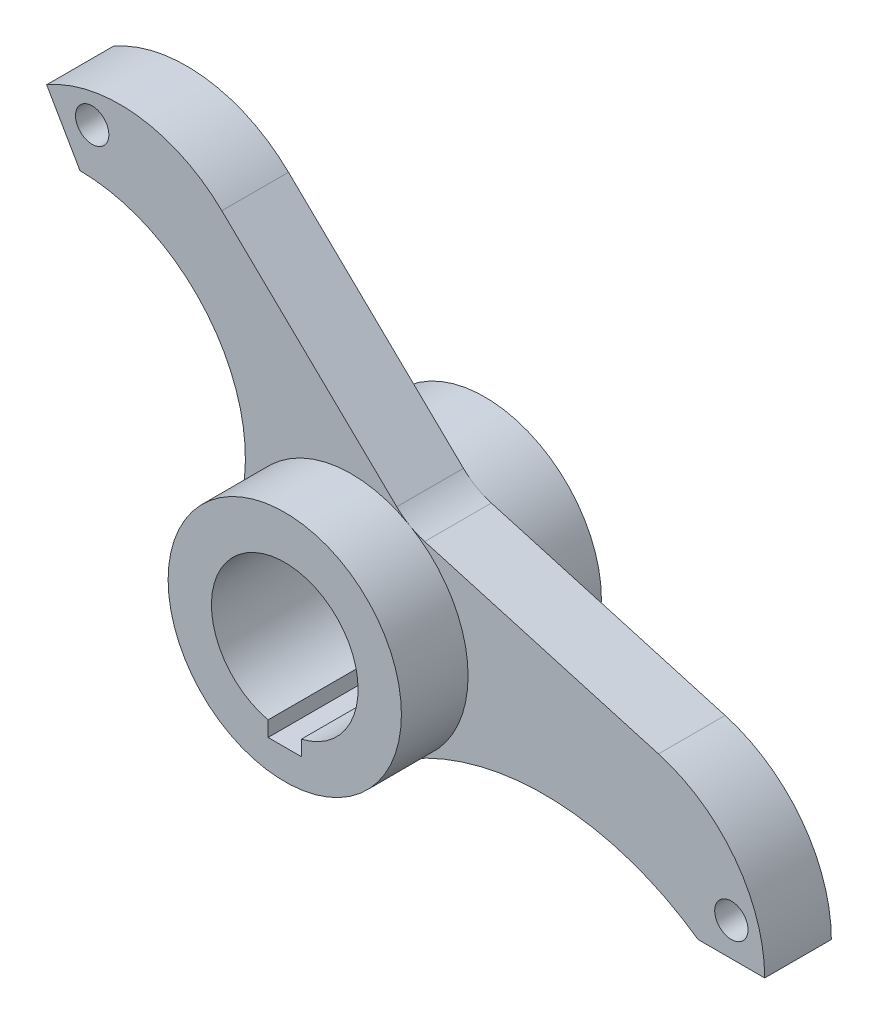
ISO-10303-21;
HEADER;
FILE_DESCRIPTION(('STEP AP214'),'2;1');
FILE_NAME('part.step','',(''),(''),'','','');
FILE_SCHEMA(('AUTOMOTIVE_DESIGN { 1 0 10303 214 1 1 1 1 }'));
ENDSEC;
DATA;
#1=APPLICATION_CONTEXT('core data for automotive mechanical design processes');
#2=APPLICATION_PROTOCOL_DEFINITION('international standard','automotive_design',2000,#1);
#3=PRODUCT_CONTEXT('',#1,'mechanical');
#4=PRODUCT('Part','Part','',(#3));
#5=PRODUCT_RELATED_PRODUCT_CATEGORY('part','',(#4));
#6=PRODUCT_DEFINITION_FORMATION('','',#4);
#7=PRODUCT_DEFINITION_CONTEXT('part definition',#1,'design');
#8=PRODUCT_DEFINITION('design','',#6,#7);
#9=PRODUCT_DEFINITION_SHAPE('','',#8);
#10=(LENGTH_UNIT() NAMED_UNIT(*) SI_UNIT(.MILLI.,.METRE.));
#11=(NAMED_UNIT(*) PLANE_ANGLE_UNIT() SI_UNIT($,.RADIAN.));
#12=(NAMED_UNIT(*) SI_UNIT($,.STERADIAN.) SOLID_ANGLE_UNIT());
#13=UNCERTAINTY_MEASURE_WITH_UNIT(LENGTH_MEASURE(1.E-05),#10,'distance_accuracy_value','');
#14=(GEOMETRIC_REPRESENTATION_CONTEXT(3) GLOBAL_UNCERTAINTY_ASSIGNED_CONTEXT((#13)) GLOBAL_UNIT_ASSIGNED_CONTEXT((#10,
#11,#12)) REPRESENTATION_CONTEXT('',''));
#15=CARTESIAN_POINT('',(0.,0.,0.));
#16=DIRECTION('',(0.,0.,1.));
#17=DIRECTION('',(1.,0.,0.));
#18=AXIS2_PLACEMENT_3D('',#15,#16,#17);
#19=CARTESIAN_POINT('',(13.7499999999999,23.8156986040721,5.));
#20=DIRECTION('',(0.,0.,-1.));
#21=DIRECTION('',(-1.,0.,0.));
#22=AXIS2_PLACEMENT_3D('',#19,#20,#21);
#23=CYLINDRICAL_SURFACE('',#22,10.);
#24=CARTESIAN_POINT('',(13.7499999999999,23.8156986040721,-5.));
#25=DIRECTION('',(0.,0.,1.));
#26=DIRECTION('',(1.,0.,0.));
#27=AXIS2_PLACEMENT_3D('',#24,#25,#26);
#28=CIRCLE('',#27,10.);
#29=CARTESIAN_POINT('',(6.80323629447186,16.6224744299233,-5.));
#30=VERTEX_POINT('',#29);
#31=CARTESIAN_POINT('',(8.74999999999996,15.1554445662277,-5.));
#32=VERTEX_POINT('',#31);
#33=EDGE_CURVE('E269',#30,#32,#28,.T.);
#34=ORIENTED_EDGE('',*,*,#33,.F.);
#35=DIRECTION('',(0.,0.,-1.));
#36=VECTOR('',#35,1.);
#37=CARTESIAN_POINT('',(6.80323629447186,16.6224744299233,5.));
#38=LINE('',#37,#36);
#39=CARTESIAN_POINT('',(6.80323629447186,16.6224744299233,5.));
#40=VERTEX_POINT('',#39);
#41=EDGE_CURVE('E11',#40,#30,#38,.T.);
#42=ORIENTED_EDGE('',*,*,#41,.F.);
#43=CARTESIAN_POINT('',(13.7499999999999,23.8156986040721,5.));
#44=DIRECTION('',(0.,0.,1.));
#45=DIRECTION('',(1.,0.,0.));
#46=AXIS2_PLACEMENT_3D('',#43,#44,#45);
#47=CIRCLE('',#46,10.);
#48=CARTESIAN_POINT('',(8.74999999999996,15.1554445662277,5.));
#49=VERTEX_POINT('',#48);
#50=EDGE_CURVE('E270',#40,#49,#47,.T.);
#51=ORIENTED_EDGE('',*,*,#50,.T.);
#52=CARTESIAN_POINT('',(13.7499999999999,23.8156986040721,5.));
#53=DIRECTION('',(0.,0.,1.));
#54=DIRECTION('',(1.,0.,0.));
#55=AXIS2_PLACEMENT_3D('',#52,#53,#54);
#56=CIRCLE('',#55,10.);
#57=CARTESIAN_POINT('',(10.9938669828349,14.2030126739227,5.));
#58=VERTEX_POINT('',#57);
#59=EDGE_CURVE('E187',#49,#58,#56,.T.);
#60=ORIENTED_EDGE('',*,*,#59,.T.);
#61=DIRECTION('',(0.,0.,-1.));
#62=VECTOR('',#61,1.);
#63=CARTESIAN_POINT('',(10.9938669828349,14.2030126739227,5.));
#64=LINE('',#63,#62);
#65=CARTESIAN_POINT('',(10.9938669828349,14.2030126739227,-5.));
#66=VERTEX_POINT('',#65);
#67=EDGE_CURVE('E210',#58,#66,#64,.T.);
#68=ORIENTED_EDGE('',*,*,#67,.T.);
#69=CARTESIAN_POINT('',(13.7499999999999,23.8156986040721,-5.));
#70=DIRECTION('',(0.,0.,1.));
#71=DIRECTION('',(1.,0.,0.));
#72=AXIS2_PLACEMENT_3D('',#69,#70,#71);
#73=CIRCLE('',#72,10.);
#74=EDGE_CURVE('E176',#32,#66,#73,.T.);
#75=ORIENTED_EDGE('',*,*,#74,.F.);
#76=EDGE_LOOP('',(#34,#42,#51,#60,#68,#75));
#77=FACE_BOUND('',#76,.T.);
#78=ADVANCED_FACE('F43',(#77),#23,.F.);
#79=CARTESIAN_POINT('',(11.5892622621873,12.0004314237112,5.));
#80=DIRECTION('',(0.694676370552807,0.719322417414874,0.));
#81=DIRECTION('',(-0.719322417414874,0.694676370552807,0.));
#82=AXIS2_PLACEMENT_3D('',#79,#80,#81);
#83=PLANE('',#82);
#84=DIRECTION('',(0.719322417414874,-0.694676370552807,0.));
#85=VECTOR('',#84,1.);
#86=CARTESIAN_POINT('',(11.5892622621873,12.0004314237112,-5.));
#87=LINE('',#86,#85);
#88=CARTESIAN_POINT('',(-19.4395517121738,41.9661093345046,-5.));
#89=VERTEX_POINT('',#88);
#90=EDGE_CURVE('E296',#89,#30,#87,.T.);
#91=ORIENTED_EDGE('',*,*,#90,.F.);
#92=DIRECTION('',(0.,0.,-1.));
#93=VECTOR('',#92,1.);
#94=CARTESIAN_POINT('',(-19.4395517121738,41.9661093345046,5.));
#95=LINE('',#94,#93);
#96=CARTESIAN_POINT('',(-19.4395517121738,41.9661093345046,5.));
#97=VERTEX_POINT('',#96);
#98=EDGE_CURVE('E51',#97,#89,#95,.T.);
#99=ORIENTED_EDGE('',*,*,#98,.F.);
#100=DIRECTION('',(0.719322417414874,-0.694676370552807,0.));
#101=VECTOR('',#100,1.);
#102=CARTESIAN_POINT('',(11.5892622621873,12.0004314237112,5.));
#103=LINE('',#102,#101);
#104=EDGE_CURVE('E274',#97,#40,#103,.T.);
#105=ORIENTED_EDGE('',*,*,#104,.T.);
#106=ORIENTED_EDGE('',*,*,#41,.T.);
#107=EDGE_LOOP('',(#91,#99,#105,#106));
#108=FACE_BOUND('',#107,.T.);
#109=ADVANCED_FACE('F330',(#108),#83,.T.);
#110=CARTESIAN_POINT('',(-34.7224318643356,26.1410161513774,5.));
#111=DIRECTION('',(0.,0.,-1.));
#112=DIRECTION('',(-1.,0.,0.));
#113=AXIS2_PLACEMENT_3D('',#110,#111,#112);
#114=CYLINDRICAL_SURFACE('',#113,22.);
#115=CARTESIAN_POINT('',(-34.7224318643356,26.1410161513774,-5.));
#116=DIRECTION('',(0.,0.,1.));
#117=DIRECTION('',(1.,0.,0.));
#118=AXIS2_PLACEMENT_3D('',#115,#116,#117);
#119=CIRCLE('',#118,22.);
#120=CARTESIAN_POINT('',(-45.7224318643357,45.193575034635,-5.));
#121=VERTEX_POINT('',#120);
#122=EDGE_CURVE('E300',#121,#89,#119,.F.);
#123=ORIENTED_EDGE('',*,*,#122,.F.);
#124=DIRECTION('',(0.,0.,-1.));
#125=VECTOR('',#124,1.);
#126=CARTESIAN_POINT('',(-45.7224318643357,45.193575034635,5.));
#127=LINE('',#126,#125);
#128=CARTESIAN_POINT('',(-45.7224318643357,45.193575034635,5.));
#129=VERTEX_POINT('',#128);
#130=EDGE_CURVE('E320',#129,#121,#127,.T.);
#131=ORIENTED_EDGE('',*,*,#130,.F.);
#132=CARTESIAN_POINT('',(-34.7224318643356,26.1410161513774,5.));
#133=DIRECTION('',(0.,0.,1.));
#134=DIRECTION('',(1.,0.,0.));
#135=AXIS2_PLACEMENT_3D('',#132,#133,#134);
#136=CIRCLE('',#135,22.);
#137=EDGE_CURVE('E279',#129,#97,#136,.F.);
#138=ORIENTED_EDGE('',*,*,#137,.T.);
#139=ORIENTED_EDGE('',*,*,#98,.T.);
#140=EDGE_LOOP('',(#123,#131,#138,#139));
#141=FACE_BOUND('',#140,.T.);
#142=ADVANCED_FACE('F326',(#141),#114,.T.);
#143=CARTESIAN_POINT('',(-14.7224318643355,-8.50000000000009,5.));
#144=DIRECTION('',(0.866025403784436,0.500000000000004,0.));
#145=DIRECTION('',(-0.500000000000004,0.866025403784436,0.));
#146=AXIS2_PLACEMENT_3D('',#143,#144,#145);
#147=PLANE('',#146);
#148=DIRECTION('',(0.500000000000004,-0.866025403784436,0.));
#149=VECTOR('',#148,1.);
#150=CARTESIAN_POINT('',(-14.7224318643355,-8.50000000000009,-5.));
#151=LINE('',#150,#149);
#152=CARTESIAN_POINT('',(-40.7224318643357,36.5333209967906,-5.));
#153=VERTEX_POINT('',#152);
#154=EDGE_CURVE('E304',#121,#153,#151,.T.);
#155=ORIENTED_EDGE('',*,*,#154,.T.);
#156=DIRECTION('',(0.,0.,-1.));
#157=VECTOR('',#156,1.);
#158=CARTESIAN_POINT('',(-40.7224318643357,36.5333209967906,5.));
#159=LINE('',#158,#157);
#160=CARTESIAN_POINT('',(-40.7224318643357,36.5333209967906,5.));
#161=VERTEX_POINT('',#160);
#162=EDGE_CURVE('E316',#161,#153,#159,.T.);
#163=ORIENTED_EDGE('',*,*,#162,.F.);
#164=DIRECTION('',(0.500000000000004,-0.866025403784436,0.));
#165=VECTOR('',#164,1.);
#166=CARTESIAN_POINT('',(-14.7224318643355,-8.50000000000009,5.));
#167=LINE('',#166,#165);
#168=EDGE_CURVE('E283',#129,#161,#167,.T.);
#169=ORIENTED_EDGE('',*,*,#168,.F.);
#170=ORIENTED_EDGE('',*,*,#130,.T.);
#171=EDGE_LOOP('',(#155,#163,#169,#170));
#172=FACE_BOUND('',#171,.T.);
#173=ADVANCED_FACE('F338',(#172),#147,.F.);
#174=CARTESIAN_POINT('',(-40.9049768767639,11.5339874593053,5.));
#175=DIRECTION('',(0.,0.,-1.));
#176=DIRECTION('',(-1.,0.,0.));
#177=AXIS2_PLACEMENT_3D('',#174,#175,#176);
#178=CYLINDRICAL_SURFACE('',#177,25.);
#179=CARTESIAN_POINT('',(-40.9049768767639,11.5339874593053,-5.));
#180=DIRECTION('',(0.,0.,1.));
#181=DIRECTION('',(1.,0.,0.));
#182=AXIS2_PLACEMENT_3D('',#179,#180,#181);
#183=CIRCLE('',#182,25.);
#184=CARTESIAN_POINT('',(-16.8432257727851,4.74928895383159,-5.));
#185=VERTEX_POINT('',#184);
#186=EDGE_CURVE('E307',#153,#185,#183,.F.);
#187=ORIENTED_EDGE('',*,*,#186,.T.);
#188=DIRECTION('',(0.,0.,-1.));
#189=VECTOR('',#188,1.);
#190=CARTESIAN_POINT('',(-16.8432257727851,4.74928895383159,5.));
#191=LINE('',#190,#189);
#192=CARTESIAN_POINT('',(-16.8432257727851,4.74928895383159,5.));
#193=VERTEX_POINT('',#192);
#194=EDGE_CURVE('E293',#193,#185,#191,.T.);
#195=ORIENTED_EDGE('',*,*,#194,.F.);
#196=CARTESIAN_POINT('',(-40.9049768767639,11.5339874593053,5.));
#197=DIRECTION('',(0.,0.,1.));
#198=DIRECTION('',(1.,0.,0.));
#199=AXIS2_PLACEMENT_3D('',#196,#197,#198);
#200=CIRCLE('',#199,25.);
#201=EDGE_CURVE('E286',#161,#193,#200,.F.);
#202=ORIENTED_EDGE('',*,*,#201,.F.);
#203=ORIENTED_EDGE('',*,*,#162,.T.);
#204=EDGE_LOOP('',(#187,#195,#202,#203));
#205=FACE_BOUND('',#204,.T.);
#206=ADVANCED_FACE('F342',(#205),#178,.F.);
#207=CARTESIAN_POINT('',(0.,0.,5.));
#208=DIRECTION('',(0.,0.,1.));
#209=DIRECTION('',(1.,0.,0.));
#210=AXIS2_PLACEMENT_3D('',#207,#208,#209);
#211=PLANE('',#210);
#212=CARTESIAN_POINT('',(-38.8923048454135,43.3634480157128,5.));
#213=DIRECTION('',(0.,0.,1.));
#214=DIRECTION('',(1.,0.,0.));
#215=AXIS2_PLACEMENT_3D('',#212,#213,#214);
#216=CIRCLE('',#215,2.5);
#217=CARTESIAN_POINT('',(-36.3923048454135,43.3634480157128,5.));
#218=VERTEX_POINT('',#217);
#219=EDGE_CURVE('E618',#218,#218,#216,.T.);
#220=ORIENTED_EDGE('',*,*,#219,.F.);
#221=EDGE_LOOP('',(#220));
#222=FACE_BOUND('',#221,.T.);
#223=ORIENTED_EDGE('',*,*,#50,.F.);
#224=ORIENTED_EDGE('',*,*,#104,.F.);
#225=ORIENTED_EDGE('',*,*,#137,.F.);
#226=ORIENTED_EDGE('',*,*,#168,.T.);
#227=ORIENTED_EDGE('',*,*,#201,.T.);
#228=CARTESIAN_POINT('',(0.,0.,5.));
#229=DIRECTION('',(0.,0.,1.));
#230=DIRECTION('',(1.,0.,0.));
#231=AXIS2_PLACEMENT_3D('',#228,#229,#230);
#232=CIRCLE('',#231,17.5);
#233=EDGE_CURVE('E290',#49,#193,#232,.T.);
#234=ORIENTED_EDGE('',*,*,#233,.F.);
#235=EDGE_LOOP('',(#223,#224,#225,#226,#227,#234));
#236=FACE_BOUND('',#235,.T.);
#237=ADVANCED_FACE('F347',(#222,#236),#211,.T.);
#238=CARTESIAN_POINT('',(0.,0.,-5.));
#239=DIRECTION('',(0.,0.,1.));
#240=DIRECTION('',(1.,0.,0.));
#241=AXIS2_PLACEMENT_3D('',#238,#239,#240);
#242=PLANE('',#241);
#243=CARTESIAN_POINT('',(-38.8923048454135,43.3634480157128,-5.));
#244=DIRECTION('',(0.,0.,1.));
#245=DIRECTION('',(1.,0.,0.));
#246=AXIS2_PLACEMENT_3D('',#243,#244,#245);
#247=CIRCLE('',#246,2.5);
#248=CARTESIAN_POINT('',(-36.3923048454135,43.3634480157128,-5.));
#249=VERTEX_POINT('',#248);
#250=EDGE_CURVE('E615',#249,#249,#247,.T.);
#251=ORIENTED_EDGE('',*,*,#250,.T.);
#252=EDGE_LOOP('',(#251));
#253=FACE_BOUND('',#252,.T.);
#254=ORIENTED_EDGE('',*,*,#33,.T.);
#255=CARTESIAN_POINT('',(0.,0.,-5.));
#256=DIRECTION('',(0.,0.,1.));
#257=DIRECTION('',(1.,0.,0.));
#258=AXIS2_PLACEMENT_3D('',#255,#256,#257);
#259=CIRCLE('',#258,17.5);
#260=EDGE_CURVE('E275',#32,#185,#259,.T.);
#261=ORIENTED_EDGE('',*,*,#260,.T.);
#262=ORIENTED_EDGE('',*,*,#186,.F.);
#263=ORIENTED_EDGE('',*,*,#154,.F.);
#264=ORIENTED_EDGE('',*,*,#122,.T.);
#265=ORIENTED_EDGE('',*,*,#90,.T.);
#266=EDGE_LOOP('',(#254,#261,#262,#263,#264,#265));
#267=FACE_BOUND('',#266,.T.);
#268=ADVANCED_FACE('F334',(#253,#267),#242,.F.);
#269=CARTESIAN_POINT('',(0.,0.,15.));
#270=DIRECTION('',(0.,0.,-1.));
#271=DIRECTION('',(-1.,0.,0.));
#272=AXIS2_PLACEMENT_3D('',#269,#270,#271);
#273=CYLINDRICAL_SURFACE('',#272,11.);
#274=CARTESIAN_POINT('',(0.,0.,-15.));
#275=DIRECTION('',(0.,0.,1.));
#276=DIRECTION('',(1.,0.,0.));
#277=AXIS2_PLACEMENT_3D('',#274,#275,#276);
#278=CIRCLE('',#277,11.);
#279=CARTESIAN_POINT('',(2.5,-10.7121426428143,-15.));
#280=VERTEX_POINT('',#279);
#281=CARTESIAN_POINT('',(-2.5,-10.7121426428143,-15.));
#282=VERTEX_POINT('',#281);
#283=EDGE_CURVE('E158',#280,#282,#278,.T.);
#284=ORIENTED_EDGE('',*,*,#283,.F.);
#285=DIRECTION('',(0.,0.,-1.));
#286=VECTOR('',#285,1.);
#287=CARTESIAN_POINT('',(2.5,-10.7121426428143,15.));
#288=LINE('',#287,#286);
#289=CARTESIAN_POINT('',(2.5,-10.7121426428143,15.));
#290=VERTEX_POINT('',#289);
#291=EDGE_CURVE('E266',#290,#280,#288,.T.);
#292=ORIENTED_EDGE('',*,*,#291,.F.);
#293=CARTESIAN_POINT('',(0.,0.,15.));
#294=DIRECTION('',(0.,0.,1.));
#295=DIRECTION('',(1.,0.,0.));
#296=AXIS2_PLACEMENT_3D('',#293,#294,#295);
#297=CIRCLE('',#296,11.);
#298=CARTESIAN_POINT('',(-2.5,-10.7121426428143,15.));
#299=VERTEX_POINT('',#298);
#300=EDGE_CURVE('E219',#290,#299,#297,.T.);
#301=ORIENTED_EDGE('',*,*,#300,.T.);
#302=DIRECTION('',(0.,0.,-1.));
#303=VECTOR('',#302,1.);
#304=CARTESIAN_POINT('',(-2.5,-10.7121426428143,15.));
#305=LINE('',#304,#303);
#306=EDGE_CURVE('E239',#299,#282,#305,.T.);
#307=ORIENTED_EDGE('',*,*,#306,.T.);
#308=EDGE_LOOP('',(#284,#292,#301,#307));
#309=FACE_BOUND('',#308,.T.);
#310=ADVANCED_FACE('F386',(#309),#273,.F.);
#311=CARTESIAN_POINT('',(2.5,0.,15.));
#312=DIRECTION('',(1.,0.,0.));
#313=DIRECTION('',(0.,1.,0.));
#314=AXIS2_PLACEMENT_3D('',#311,#312,#313);
#315=PLANE('',#314);
#316=DIRECTION('',(0.,-1.,0.));
#317=VECTOR('',#316,1.);
#318=CARTESIAN_POINT('',(2.5,0.,-15.));
#319=LINE('',#318,#317);
#320=CARTESIAN_POINT('',(2.5,-13.,-15.));
#321=VERTEX_POINT('',#320);
#322=EDGE_CURVE('E243',#280,#321,#319,.T.);
#323=ORIENTED_EDGE('',*,*,#322,.T.);
#324=DIRECTION('',(0.,0.,-1.));
#325=VECTOR('',#324,1.);
#326=CARTESIAN_POINT('',(2.5,-13.,15.));
#327=LINE('',#326,#325);
#328=CARTESIAN_POINT('',(2.5,-13.,15.));
#329=VERTEX_POINT('',#328);
#330=EDGE_CURVE('E263',#329,#321,#327,.T.);
#331=ORIENTED_EDGE('',*,*,#330,.F.);
#332=DIRECTION('',(0.,-1.,0.));
#333=VECTOR('',#332,1.);
#334=CARTESIAN_POINT('',(2.5,0.,15.));
#335=LINE('',#334,#333);
#336=EDGE_CURVE('E223',#290,#329,#335,.T.);
#337=ORIENTED_EDGE('',*,*,#336,.F.);
#338=ORIENTED_EDGE('',*,*,#291,.T.);
#339=EDGE_LOOP('',(#323,#331,#337,#338));
#340=FACE_BOUND('',#339,.T.);
#341=ADVANCED_FACE('F393',(#340),#315,.F.);
#342=CARTESIAN_POINT('',(0.,-13.,15.));
#343=DIRECTION('',(0.,1.,0.));
#344=DIRECTION('',(0.,0.,1.));
#345=AXIS2_PLACEMENT_3D('',#342,#343,#344);
#346=PLANE('',#345);
#347=DIRECTION('',(1.,0.,0.));
#348=VECTOR('',#347,1.);
#349=CARTESIAN_POINT('',(0.,-13.,-15.));
#350=LINE('',#349,#348);
#351=CARTESIAN_POINT('',(-2.5,-13.,-15.));
#352=VERTEX_POINT('',#351);
#353=EDGE_CURVE('E247',#352,#321,#350,.T.);
#354=ORIENTED_EDGE('',*,*,#353,.F.);
#355=DIRECTION('',(0.,0.,-1.));
#356=VECTOR('',#355,1.);
#357=CARTESIAN_POINT('',(-2.5,-13.,15.));
#358=LINE('',#357,#356);
#359=CARTESIAN_POINT('',(-2.5,-13.,15.));
#360=VERTEX_POINT('',#359);
#361=EDGE_CURVE('E260',#360,#352,#358,.T.);
#362=ORIENTED_EDGE('',*,*,#361,.F.);
#363=DIRECTION('',(1.,0.,0.));
#364=VECTOR('',#363,1.);
#365=CARTESIAN_POINT('',(0.,-13.,15.));
#366=LINE('',#365,#364);
#367=EDGE_CURVE('E227',#360,#329,#366,.T.);
#368=ORIENTED_EDGE('',*,*,#367,.T.);
#369=ORIENTED_EDGE('',*,*,#330,.T.);
#370=EDGE_LOOP('',(#354,#362,#368,#369));
#371=FACE_BOUND('',#370,.T.);
#372=ADVANCED_FACE('F397',(#371),#346,.T.);
#373=CARTESIAN_POINT('',(-2.5,0.,15.));
#374=DIRECTION('',(1.,0.,0.));
#375=DIRECTION('',(0.,1.,0.));
#376=AXIS2_PLACEMENT_3D('',#373,#374,#375);
#377=PLANE('',#376);
#378=DIRECTION('',(0.,-1.,0.));
#379=VECTOR('',#378,1.);
#380=CARTESIAN_POINT('',(-2.5,0.,-15.));
#381=LINE('',#380,#379);
#382=EDGE_CURVE('E251',#282,#352,#381,.T.);
#383=ORIENTED_EDGE('',*,*,#382,.F.);
#384=ORIENTED_EDGE('',*,*,#306,.F.);
#385=DIRECTION('',(0.,-1.,0.));
#386=VECTOR('',#385,1.);
#387=CARTESIAN_POINT('',(-2.5,0.,15.));
#388=LINE('',#387,#386);
#389=EDGE_CURVE('E231',#299,#360,#388,.T.);
#390=ORIENTED_EDGE('',*,*,#389,.T.);
#391=ORIENTED_EDGE('',*,*,#361,.T.);
#392=EDGE_LOOP('',(#383,#384,#390,#391));
#393=FACE_BOUND('',#392,.T.);
#394=ADVANCED_FACE('F354',(#393),#377,.T.);
#395=CARTESIAN_POINT('',(0.,0.,15.));
#396=DIRECTION('',(0.,0.,-1.));
#397=DIRECTION('',(-1.,0.,0.));
#398=AXIS2_PLACEMENT_3D('',#395,#396,#397);
#399=CYLINDRICAL_SURFACE('',#398,17.5);
#400=DIRECTION('',(0.,0.,-1.));
#401=VECTOR('',#400,1.);
#402=CARTESIAN_POINT('',(8.8083917507492,-15.1215817547416,5.));
#403=LINE('',#402,#401);
#404=CARTESIAN_POINT('',(8.80839175074921,-15.1215817547416,5.));
#405=VERTEX_POINT('',#404);
#406=CARTESIAN_POINT('',(8.8083917507492,-15.1215817547416,-5.));
#407=VERTEX_POINT('',#406);
#408=EDGE_CURVE('E58',#405,#407,#403,.T.);
#409=ORIENTED_EDGE('',*,*,#408,.F.);
#410=CARTESIAN_POINT('',(0.,0.,5.));
#411=DIRECTION('',(0.,0.,1.));
#412=DIRECTION('',(1.,0.,0.));
#413=AXIS2_PLACEMENT_3D('',#410,#411,#412);
#414=CIRCLE('',#413,17.5);
#415=EDGE_CURVE('E172',#405,#49,#414,.T.);
#416=ORIENTED_EDGE('',*,*,#415,.T.);
#417=ORIENTED_EDGE('',*,*,#233,.T.);
#418=ORIENTED_EDGE('',*,*,#194,.T.);
#419=ORIENTED_EDGE('',*,*,#260,.F.);
#420=CARTESIAN_POINT('',(0.,0.,-5.));
#421=DIRECTION('',(0.,0.,1.));
#422=DIRECTION('',(1.,0.,0.));
#423=AXIS2_PLACEMENT_3D('',#420,#421,#422);
#424=CIRCLE('',#423,17.5);
#425=EDGE_CURVE('E63',#407,#32,#424,.T.);
#426=ORIENTED_EDGE('',*,*,#425,.F.);
#427=EDGE_LOOP('',(#409,#416,#417,#418,#419,#426));
#428=FACE_BOUND('',#427,.T.);
#429=CARTESIAN_POINT('',(0.,0.,15.));
#430=DIRECTION('',(0.,0.,1.));
#431=DIRECTION('',(1.,0.,0.));
#432=AXIS2_PLACEMENT_3D('',#429,#430,#431);
#433=CIRCLE('',#432,17.5);
#434=CARTESIAN_POINT('',(17.5,0.,15.));
#435=VERTEX_POINT('',#434);
#436=EDGE_CURVE('E235',#435,#435,#433,.T.);
#437=ORIENTED_EDGE('',*,*,#436,.F.);
#438=EDGE_LOOP('',(#437));
#439=FACE_BOUND('',#438,.T.);
#440=CARTESIAN_POINT('',(0.,0.,-15.));
#441=DIRECTION('',(0.,0.,1.));
#442=DIRECTION('',(1.,0.,0.));
#443=AXIS2_PLACEMENT_3D('',#440,#441,#442);
#444=CIRCLE('',#443,17.5);
#445=CARTESIAN_POINT('',(17.5,0.,-15.));
#446=VERTEX_POINT('',#445);
#447=EDGE_CURVE('E224',#446,#446,#444,.T.);
#448=ORIENTED_EDGE('',*,*,#447,.T.);
#449=EDGE_LOOP('',(#448));
#450=FACE_BOUND('',#449,.T.);
#451=ADVANCED_FACE('F350',(#428,#439,#450),#399,.T.);
#452=CARTESIAN_POINT('',(0.,0.,15.));
#453=DIRECTION('',(0.,0.,1.));
#454=DIRECTION('',(1.,0.,0.));
#455=AXIS2_PLACEMENT_3D('',#452,#453,#454);
#456=PLANE('',#455);
#457=ORIENTED_EDGE('',*,*,#300,.F.);
#458=ORIENTED_EDGE('',*,*,#336,.T.);
#459=ORIENTED_EDGE('',*,*,#367,.F.);
#460=ORIENTED_EDGE('',*,*,#389,.F.);
#461=EDGE_LOOP('',(#457,#458,#459,#460));
#462=FACE_BOUND('',#461,.T.);
#463=ORIENTED_EDGE('',*,*,#436,.T.);
#464=EDGE_LOOP('',(#463));
#465=FACE_BOUND('',#464,.T.);
#466=ADVANCED_FACE('F353',(#462,#465),#456,.T.);
#467=CARTESIAN_POINT('',(0.,0.,-15.));
#468=DIRECTION('',(0.,0.,1.));
#469=DIRECTION('',(1.,0.,0.));
#470=AXIS2_PLACEMENT_3D('',#467,#468,#469);
#471=PLANE('',#470);
#472=ORIENTED_EDGE('',*,*,#283,.T.);
#473=ORIENTED_EDGE('',*,*,#382,.T.);
#474=ORIENTED_EDGE('',*,*,#353,.T.);
#475=ORIENTED_EDGE('',*,*,#322,.F.);
#476=EDGE_LOOP('',(#472,#473,#474,#475));
#477=FACE_BOUND('',#476,.T.);
#478=ORIENTED_EDGE('',*,*,#447,.F.);
#479=EDGE_LOOP('',(#478));
#480=FACE_BOUND('',#479,.T.);
#481=ADVANCED_FACE('F360',(#477,#480),#471,.F.);
#482=CARTESIAN_POINT('',(28.9418586096045,-49.6851971941509,5.));
#483=DIRECTION('',(0.,0.,-1.));
#484=DIRECTION('',(-1.,0.,0.));
#485=AXIS2_PLACEMENT_3D('',#482,#483,#484);
#486=CYLINDRICAL_SURFACE('',#485,40.);
#487=CARTESIAN_POINT('',(28.9418586096045,-49.6851971941509,-5.));
#488=DIRECTION('',(0.,0.,1.));
#489=DIRECTION('',(1.,0.,0.));
#490=AXIS2_PLACEMENT_3D('',#487,#488,#489);
#491=CIRCLE('',#490,40.);
#492=CARTESIAN_POINT('',(52.,-17.,-5.));
#493=VERTEX_POINT('',#492);
#494=EDGE_CURVE('E154',#493,#407,#491,.T.);
#495=ORIENTED_EDGE('',*,*,#494,.F.);
#496=DIRECTION('',(0.,0.,-1.));
#497=VECTOR('',#496,1.);
#498=CARTESIAN_POINT('',(52.,-17.,5.));
#499=LINE('',#498,#497);
#500=CARTESIAN_POINT('',(52.,-17.,5.));
#501=VERTEX_POINT('',#500);
#502=EDGE_CURVE('E147',#501,#493,#499,.T.);
#503=ORIENTED_EDGE('',*,*,#502,.F.);
#504=CARTESIAN_POINT('',(28.9418586096045,-49.6851971941509,5.));
#505=DIRECTION('',(0.,0.,1.));
#506=DIRECTION('',(1.,0.,0.));
#507=AXIS2_PLACEMENT_3D('',#504,#505,#506);
#508=CIRCLE('',#507,40.);
#509=EDGE_CURVE('E151',#501,#405,#508,.T.);
#510=ORIENTED_EDGE('',*,*,#509,.T.);
#511=ORIENTED_EDGE('',*,*,#408,.T.);
#512=EDGE_LOOP('',(#495,#503,#510,#511));
#513=FACE_BOUND('',#512,.T.);
#514=ADVANCED_FACE('F149',(#513),#486,.F.);
#515=CARTESIAN_POINT('',(0.,-17.,5.));
#516=DIRECTION('',(0.,1.,0.));
#517=DIRECTION('',(-1.,0.,0.));
#518=AXIS2_PLACEMENT_3D('',#515,#516,#517);
#519=PLANE('',#518);
#520=DIRECTION('',(1.,0.,0.));
#521=VECTOR('',#520,1.);
#522=CARTESIAN_POINT('',(0.,-17.,-5.));
#523=LINE('',#522,#521);
#524=CARTESIAN_POINT('',(62.,-17.,-5.));
#525=VERTEX_POINT('',#524);
#526=EDGE_CURVE('E195',#493,#525,#523,.T.);
#527=ORIENTED_EDGE('',*,*,#526,.T.);
#528=DIRECTION('',(0.,0.,-1.));
#529=VECTOR('',#528,1.);
#530=CARTESIAN_POINT('',(62.,-17.,5.));
#531=LINE('',#530,#529);
#532=CARTESIAN_POINT('',(62.,-17.,5.));
#533=VERTEX_POINT('',#532);
#534=EDGE_CURVE('E159',#533,#525,#531,.T.);
#535=ORIENTED_EDGE('',*,*,#534,.F.);
#536=DIRECTION('',(1.,0.,0.));
#537=VECTOR('',#536,1.);
#538=CARTESIAN_POINT('',(0.,-17.,5.));
#539=LINE('',#538,#537);
#540=EDGE_CURVE('E162',#501,#533,#539,.T.);
#541=ORIENTED_EDGE('',*,*,#540,.F.);
#542=ORIENTED_EDGE('',*,*,#502,.T.);
#543=EDGE_LOOP('',(#527,#535,#541,#542));
#544=FACE_BOUND('',#543,.T.);
#545=ADVANCED_FACE('F163',(#544),#519,.F.);
#546=CARTESIAN_POINT('',(40.,-17.,5.));
#547=DIRECTION('',(0.,0.,-1.));
#548=DIRECTION('',(-1.,0.,0.));
#549=AXIS2_PLACEMENT_3D('',#546,#547,#548);
#550=CYLINDRICAL_SURFACE('',#549,22.);
#551=CARTESIAN_POINT('',(40.,-17.,-5.));
#552=DIRECTION('',(0.,0.,1.));
#553=DIRECTION('',(1.,0.,0.));
#554=AXIS2_PLACEMENT_3D('',#551,#552,#553);
#555=CIRCLE('',#554,22.);
#556=CARTESIAN_POINT('',(46.0634926377632,4.14790904632872,-5.));
#557=VERTEX_POINT('',#556);
#558=EDGE_CURVE('E198',#525,#557,#555,.T.);
#559=ORIENTED_EDGE('',*,*,#558,.T.);
#560=DIRECTION('',(0.,0.,-1.));
#561=VECTOR('',#560,1.);
#562=CARTESIAN_POINT('',(46.0634926377632,4.14790904632872,5.));
#563=LINE('',#562,#561);
#564=CARTESIAN_POINT('',(46.0634926377632,4.14790904632872,5.));
#565=VERTEX_POINT('',#564);
#566=EDGE_CURVE('E213',#565,#557,#563,.T.);
#567=ORIENTED_EDGE('',*,*,#566,.F.);
#568=CARTESIAN_POINT('',(40.,-17.,5.));
#569=DIRECTION('',(0.,0.,1.));
#570=DIRECTION('',(1.,0.,0.));
#571=AXIS2_PLACEMENT_3D('',#568,#569,#570);
#572=CIRCLE('',#571,22.);
#573=EDGE_CURVE('E168',#533,#565,#572,.T.);
#574=ORIENTED_EDGE('',*,*,#573,.F.);
#575=ORIENTED_EDGE('',*,*,#534,.T.);
#576=EDGE_LOOP('',(#559,#567,#574,#575));
#577=FACE_BOUND('',#576,.T.);
#578=ADVANCED_FACE('F449',(#577),#550,.T.);
#579=CARTESIAN_POINT('',(4.59804733821322,16.0368112420301,5.));
#580=DIRECTION('',(-0.275613301716507,-0.961268593014942,0.));
#581=DIRECTION('',(0.961268593014942,-0.275613301716507,0.));
#582=AXIS2_PLACEMENT_3D('',#579,#580,#581);
#583=PLANE('',#582);
#584=DIRECTION('',(-0.961268593014942,0.275613301716507,0.));
#585=VECTOR('',#584,1.);
#586=CARTESIAN_POINT('',(4.59804733821322,16.0368112420301,-5.));
#587=LINE('',#586,#585);
#588=EDGE_CURVE('E201',#557,#66,#587,.T.);
#589=ORIENTED_EDGE('',*,*,#588,.T.);
#590=ORIENTED_EDGE('',*,*,#67,.F.);
#591=DIRECTION('',(-0.961268593014942,0.275613301716507,0.));
#592=VECTOR('',#591,1.);
#593=CARTESIAN_POINT('',(4.59804733821322,16.0368112420301,5.));
#594=LINE('',#593,#592);
#595=EDGE_CURVE('E184',#565,#58,#594,.T.);
#596=ORIENTED_EDGE('',*,*,#595,.F.);
#597=ORIENTED_EDGE('',*,*,#566,.T.);
#598=EDGE_LOOP('',(#589,#590,#596,#597));
#599=FACE_BOUND('',#598,.T.);
#600=ADVANCED_FACE('F458',(#599),#583,.F.);
#601=CARTESIAN_POINT('',(0.,0.,5.));
#602=DIRECTION('',(0.,0.,1.));
#603=DIRECTION('',(1.,0.,0.));
#604=AXIS2_PLACEMENT_3D('',#601,#602,#603);
#605=PLANE('',#604);
#606=CARTESIAN_POINT('',(57.,-12.,5.));
#607=DIRECTION('',(0.,0.,1.));
#608=DIRECTION('',(1.,0.,0.));
#609=AXIS2_PLACEMENT_3D('',#606,#607,#608);
#610=CIRCLE('',#609,2.5);
#611=CARTESIAN_POINT('',(59.5,-12.,5.));
#612=VERTEX_POINT('',#611);
#613=EDGE_CURVE('E622',#612,#612,#610,.T.);
#614=ORIENTED_EDGE('',*,*,#613,.F.);
#615=EDGE_LOOP('',(#614));
#616=FACE_BOUND('',#615,.T.);
#617=ORIENTED_EDGE('',*,*,#509,.F.);
#618=ORIENTED_EDGE('',*,*,#540,.T.);
#619=ORIENTED_EDGE('',*,*,#573,.T.);
#620=ORIENTED_EDGE('',*,*,#595,.T.);
#621=ORIENTED_EDGE('',*,*,#59,.F.);
#622=ORIENTED_EDGE('',*,*,#415,.F.);
#623=EDGE_LOOP('',(#617,#618,#619,#620,#621,#622));
#624=FACE_BOUND('',#623,.T.);
#625=ADVANCED_FACE('F170',(#616,#624),#605,.T.);
#626=CARTESIAN_POINT('',(0.,0.,-5.));
#627=DIRECTION('',(0.,0.,1.));
#628=DIRECTION('',(1.,0.,0.));
#629=AXIS2_PLACEMENT_3D('',#626,#627,#628);
#630=PLANE('',#629);
#631=CARTESIAN_POINT('',(57.,-12.,-5.));
#632=DIRECTION('',(0.,0.,1.));
#633=DIRECTION('',(1.,0.,0.));
#634=AXIS2_PLACEMENT_3D('',#631,#632,#633);
#635=CIRCLE('',#634,2.5);
#636=CARTESIAN_POINT('',(59.5,-12.,-5.));
#637=VERTEX_POINT('',#636);
#638=EDGE_CURVE('E179',#637,#637,#635,.T.);
#639=ORIENTED_EDGE('',*,*,#638,.T.);
#640=EDGE_LOOP('',(#639));
#641=FACE_BOUND('',#640,.T.);
#642=ORIENTED_EDGE('',*,*,#494,.T.);
#643=ORIENTED_EDGE('',*,*,#425,.T.);
#644=ORIENTED_EDGE('',*,*,#74,.T.);
#645=ORIENTED_EDGE('',*,*,#588,.F.);
#646=ORIENTED_EDGE('',*,*,#558,.F.);
#647=ORIENTED_EDGE('',*,*,#526,.F.);
#648=EDGE_LOOP('',(#642,#643,#644,#645,#646,#647));
#649=FACE_BOUND('',#648,.T.);
#650=ADVANCED_FACE('F491',(#641,#649),#630,.F.);
#651=CARTESIAN_POINT('',(57.,-12.,5.));
#652=DIRECTION('',(0.,0.,1.));
#653=DIRECTION('',(1.,0.,0.));
#654=AXIS2_PLACEMENT_3D('',#651,#652,#653);
#655=CYLINDRICAL_SURFACE('',#654,2.5);
#656=ORIENTED_EDGE('',*,*,#638,.F.);
#657=EDGE_LOOP('',(#656));
#658=FACE_BOUND('',#657,.T.);
#659=ORIENTED_EDGE('',*,*,#613,.T.);
#660=EDGE_LOOP('',(#659));
#661=FACE_BOUND('',#660,.T.);
#662=ADVANCED_FACE('F501',(#658,#661),#655,.F.);
#663=CARTESIAN_POINT('',(-38.8923048454135,43.3634480157128,5.));
#664=DIRECTION('',(0.,0.,1.));
#665=DIRECTION('',(1.,0.,0.));
#666=AXIS2_PLACEMENT_3D('',#663,#664,#665);
#667=CYLINDRICAL_SURFACE('',#666,2.5);
#668=ORIENTED_EDGE('',*,*,#250,.F.);
#669=EDGE_LOOP('',(#668));
#670=FACE_BOUND('',#669,.T.);
#671=ORIENTED_EDGE('',*,*,#219,.T.);
#672=EDGE_LOOP('',(#671));
#673=FACE_BOUND('',#672,.T.);
#674=ADVANCED_FACE('F511',(#670,#673),#667,.F.);
#675=CLOSED_SHELL('',(#78,#109,#142,#173,#206,#237,#268,#310,#341,#372,#394,#451,#466,#481,#514,
#545,#578,#600,#625,#650,#662,#674));
#676=MANIFOLD_SOLID_BREP('B2',#675);
#677=ADVANCED_BREP_SHAPE_REPRESENTATION('',(#18,#676),#14);
#678=SHAPE_DEFINITION_REPRESENTATION(#9,#677);
ENDSEC;
END-ISO-10303-21;
